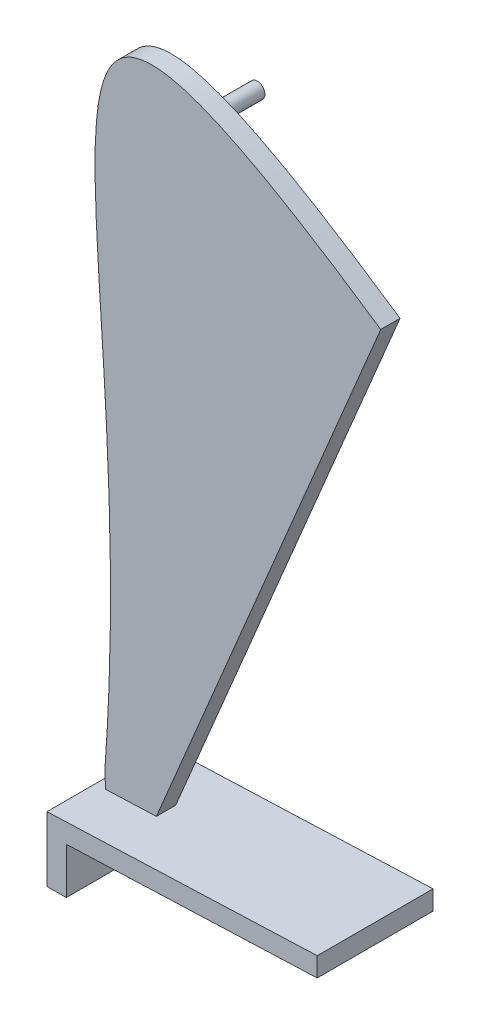
ISO-10303-21;
HEADER;
FILE_DESCRIPTION(('STEP AP214'),'2;1');
FILE_NAME('part.step','',(''),(''),'','','');
FILE_SCHEMA(('AUTOMOTIVE_DESIGN { 1 0 10303 214 1 1 1 1 }'));
ENDSEC;
DATA;
#1=APPLICATION_CONTEXT('core data for automotive mechanical design processes');
#2=APPLICATION_PROTOCOL_DEFINITION('international standard','automotive_design',2000,#1);
#3=PRODUCT_CONTEXT('',#1,'mechanical');
#4=PRODUCT('Part','Part','',(#3));
#5=PRODUCT_RELATED_PRODUCT_CATEGORY('part','',(#4));
#6=PRODUCT_DEFINITION_FORMATION('','',#4);
#7=PRODUCT_DEFINITION_CONTEXT('part definition',#1,'design');
#8=PRODUCT_DEFINITION('design','',#6,#7);
#9=PRODUCT_DEFINITION_SHAPE('','',#8);
#10=(LENGTH_UNIT() NAMED_UNIT(*) SI_UNIT(.MILLI.,.METRE.));
#11=(NAMED_UNIT(*) PLANE_ANGLE_UNIT() SI_UNIT($,.RADIAN.));
#12=(NAMED_UNIT(*) SI_UNIT($,.STERADIAN.) SOLID_ANGLE_UNIT());
#13=UNCERTAINTY_MEASURE_WITH_UNIT(LENGTH_MEASURE(1.E-05),#10,'distance_accuracy_value','');
#14=(GEOMETRIC_REPRESENTATION_CONTEXT(3) GLOBAL_UNCERTAINTY_ASSIGNED_CONTEXT((#13)) GLOBAL_UNIT_ASSIGNED_CONTEXT((#10,
#11,#12)) REPRESENTATION_CONTEXT('',''));
#15=CARTESIAN_POINT('',(0.,0.,0.));
#16=DIRECTION('',(0.,0.,1.));
#17=DIRECTION('',(1.,0.,0.));
#18=AXIS2_PLACEMENT_3D('',#15,#16,#17);
#19=CARTESIAN_POINT('',(-71.,15.773666999042,15.));
#20=DIRECTION('',(0.0384331221012046,-0.999261174631314,0.));
#21=DIRECTION('',(0.999261174631314,0.0384331221012046,0.));
#22=AXIS2_PLACEMENT_3D('',#19,#20,#21);
#23=PLANE('',#22);
#24=DIRECTION('',(-0.999261174631314,-0.0384331221012046,0.));
#25=VECTOR('',#24,1.);
#26=CARTESIAN_POINT('',(-71.,15.773666999042,-15.));
#27=LINE('',#26,#25);
#28=CARTESIAN_POINT('',(-1.,18.4659746913497,-15.));
#29=VERTEX_POINT('',#28);
#30=CARTESIAN_POINT('',(-71.,15.773666999042,-15.));
#31=VERTEX_POINT('',#30);
#32=EDGE_CURVE('E121',#29,#31,#27,.T.);
#33=ORIENTED_EDGE('',*,*,#32,.T.);
#34=DIRECTION('',(0.,0.,-1.));
#35=VECTOR('',#34,1.);
#36=CARTESIAN_POINT('',(-71.,15.773666999042,15.));
#37=LINE('',#36,#35);
#38=CARTESIAN_POINT('',(-71.,15.773666999042,15.));
#39=VERTEX_POINT('',#38);
#40=EDGE_CURVE('E118',#39,#31,#37,.T.);
#41=ORIENTED_EDGE('',*,*,#40,.F.);
#42=DIRECTION('',(-0.999261174631314,-0.0384331221012046,0.));
#43=VECTOR('',#42,1.);
#44=CARTESIAN_POINT('',(-71.,15.773666999042,15.));
#45=LINE('',#44,#43);
#46=CARTESIAN_POINT('',(-1.,18.4659746913497,15.));
#47=VERTEX_POINT('',#46);
#48=EDGE_CURVE('E105',#47,#39,#45,.T.);
#49=ORIENTED_EDGE('',*,*,#48,.F.);
#50=DIRECTION('',(0.,0.,-1.));
#51=VECTOR('',#50,1.);
#52=CARTESIAN_POINT('',(-1.,18.4659746913497,15.));
#53=LINE('',#52,#51);
#54=EDGE_CURVE('E124',#47,#29,#53,.T.);
#55=ORIENTED_EDGE('',*,*,#54,.T.);
#56=EDGE_LOOP('',(#33,#41,#49,#55));
#57=FACE_BOUND('',#56,.T.);
#58=DIRECTION('',(0.999261174631314,0.0384331221012045,0.));
#59=VECTOR('',#58,1.);
#60=CARTESIAN_POINT('',(-55.1599194874851,16.382900864908,2.5));
#61=LINE('',#60,#59);
#62=CARTESIAN_POINT('',(-68.3293207474462,15.8763854318325,2.5));
#63=VERTEX_POINT('',#62);
#64=CARTESIAN_POINT('',(-55.1599194874851,16.382900864908,2.5));
#65=VERTEX_POINT('',#64);
#66=EDGE_CURVE('E175',#63,#65,#61,.T.);
#67=ORIENTED_EDGE('',*,*,#66,.F.);
#68=DIRECTION('',(0.,0.,-1.));
#69=VECTOR('',#68,1.);
#70=CARTESIAN_POINT('',(-68.3293207474462,15.8763854318325,2.5));
#71=LINE('',#70,#69);
#72=CARTESIAN_POINT('',(-68.3293207474462,15.8763854318325,-2.5));
#73=VERTEX_POINT('',#72);
#74=EDGE_CURVE('E168',#63,#73,#71,.T.);
#75=ORIENTED_EDGE('',*,*,#74,.T.);
#76=DIRECTION('',(0.999261174631314,0.0384331221012045,0.));
#77=VECTOR('',#76,1.);
#78=CARTESIAN_POINT('',(-55.1599194874851,16.382900864908,-2.5));
#79=LINE('',#78,#77);
#80=CARTESIAN_POINT('',(-55.1599194874851,16.382900864908,-2.5));
#81=VERTEX_POINT('',#80);
#82=EDGE_CURVE('E186',#73,#81,#79,.T.);
#83=ORIENTED_EDGE('',*,*,#82,.T.);
#84=DIRECTION('',(0.,0.,-1.));
#85=VECTOR('',#84,1.);
#86=CARTESIAN_POINT('',(-55.1599194874851,16.382900864908,2.5));
#87=LINE('',#86,#85);
#88=EDGE_CURVE('E51',#65,#81,#87,.T.);
#89=ORIENTED_EDGE('',*,*,#88,.F.);
#90=EDGE_LOOP('',(#67,#75,#83,#89));
#91=FACE_BOUND('',#90,.T.);
#92=ADVANCED_FACE('F36',(#57,#91),#23,.F.);
#93=CARTESIAN_POINT('',(-66.,-1.,15.));
#94=DIRECTION('',(-1.,0.,0.));
#95=DIRECTION('',(0.,0.,1.));
#96=AXIS2_PLACEMENT_3D('',#93,#94,#95);
#97=PLANE('',#96);
#98=DIRECTION('',(0.,1.,0.));
#99=VECTOR('',#98,1.);
#100=CARTESIAN_POINT('',(-66.,-1.,-15.));
#101=LINE('',#100,#99);
#102=CARTESIAN_POINT('',(-66.,-1.,-15.));
#103=VERTEX_POINT('',#102);
#104=CARTESIAN_POINT('',(-66.,10.9622778331737,-15.));
#105=VERTEX_POINT('',#104);
#106=EDGE_CURVE('E133',#103,#105,#101,.T.);
#107=ORIENTED_EDGE('',*,*,#106,.T.);
#108=DIRECTION('',(0.,0.,-1.));
#109=VECTOR('',#108,1.);
#110=CARTESIAN_POINT('',(-66.,10.9622778331737,15.));
#111=LINE('',#110,#109);
#112=CARTESIAN_POINT('',(-66.,10.9622778331737,15.));
#113=VERTEX_POINT('',#112);
#114=EDGE_CURVE('E11',#113,#105,#111,.T.);
#115=ORIENTED_EDGE('',*,*,#114,.F.);
#116=DIRECTION('',(0.,1.,0.));
#117=VECTOR('',#116,1.);
#118=CARTESIAN_POINT('',(-66.,-1.,15.));
#119=LINE('',#118,#117);
#120=CARTESIAN_POINT('',(-66.,-1.,15.));
#121=VERTEX_POINT('',#120);
#122=EDGE_CURVE('E144',#121,#113,#119,.T.);
#123=ORIENTED_EDGE('',*,*,#122,.F.);
#124=DIRECTION('',(0.,0.,-1.));
#125=VECTOR('',#124,1.);
#126=CARTESIAN_POINT('',(-66.,-1.,15.));
#127=LINE('',#126,#125);
#128=EDGE_CURVE('E129',#121,#103,#127,.T.);
#129=ORIENTED_EDGE('',*,*,#128,.T.);
#130=EDGE_LOOP('',(#107,#115,#123,#129));
#131=FACE_BOUND('',#130,.T.);
#132=ADVANCED_FACE('F38',(#131),#97,.F.);
#133=CARTESIAN_POINT('',(-66.,10.9622778331737,15.));
#134=DIRECTION('',(-0.0384331221012046,0.999261174631314,0.));
#135=DIRECTION('',(-0.999261174631314,-0.0384331221012046,0.));
#136=AXIS2_PLACEMENT_3D('',#133,#134,#135);
#137=PLANE('',#136);
#138=DIRECTION('',(0.999261174631314,0.0384331221012046,0.));
#139=VECTOR('',#138,1.);
#140=CARTESIAN_POINT('',(-66.,10.9622778331737,-15.));
#141=LINE('',#140,#139);
#142=CARTESIAN_POINT('',(-1.,13.4622778331737,-15.));
#143=VERTEX_POINT('',#142);
#144=EDGE_CURVE('E136',#105,#143,#141,.T.);
#145=ORIENTED_EDGE('',*,*,#144,.T.);
#146=DIRECTION('',(0.,0.,-1.));
#147=VECTOR('',#146,1.);
#148=CARTESIAN_POINT('',(-1.,13.4622778331737,15.));
#149=LINE('',#148,#147);
#150=CARTESIAN_POINT('',(-1.,13.4622778331737,15.));
#151=VERTEX_POINT('',#150);
#152=EDGE_CURVE('E44',#151,#143,#149,.T.);
#153=ORIENTED_EDGE('',*,*,#152,.F.);
#154=DIRECTION('',(0.999261174631314,0.0384331221012046,0.));
#155=VECTOR('',#154,1.);
#156=CARTESIAN_POINT('',(-66.,10.9622778331737,15.));
#157=LINE('',#156,#155);
#158=EDGE_CURVE('E95',#113,#151,#157,.T.);
#159=ORIENTED_EDGE('',*,*,#158,.F.);
#160=ORIENTED_EDGE('',*,*,#114,.T.);
#161=EDGE_LOOP('',(#145,#153,#159,#160));
#162=FACE_BOUND('',#161,.T.);
#163=ADVANCED_FACE('F225',(#162),#137,.F.);
#164=CARTESIAN_POINT('',(-1.,13.4622778331737,15.));
#165=DIRECTION('',(-1.,0.,0.));
#166=DIRECTION('',(0.,0.,1.));
#167=AXIS2_PLACEMENT_3D('',#164,#165,#166);
#168=PLANE('',#167);
#169=DIRECTION('',(0.,1.,0.));
#170=VECTOR('',#169,1.);
#171=CARTESIAN_POINT('',(-1.,13.4622778331737,-15.));
#172=LINE('',#171,#170);
#173=EDGE_CURVE('E138',#143,#29,#172,.T.);
#174=ORIENTED_EDGE('',*,*,#173,.T.);
#175=ORIENTED_EDGE('',*,*,#54,.F.);
#176=DIRECTION('',(0.,1.,0.));
#177=VECTOR('',#176,1.);
#178=CARTESIAN_POINT('',(-1.,13.4622778331737,15.));
#179=LINE('',#178,#177);
#180=EDGE_CURVE('E112',#151,#47,#179,.T.);
#181=ORIENTED_EDGE('',*,*,#180,.F.);
#182=ORIENTED_EDGE('',*,*,#152,.T.);
#183=EDGE_LOOP('',(#174,#175,#181,#182));
#184=FACE_BOUND('',#183,.T.);
#185=ADVANCED_FACE('F150',(#184),#168,.F.);
#186=CARTESIAN_POINT('',(-71.,-1.,15.));
#187=DIRECTION('',(1.,0.,0.));
#188=DIRECTION('',(0.,0.,-1.));
#189=AXIS2_PLACEMENT_3D('',#186,#187,#188);
#190=PLANE('',#189);
#191=DIRECTION('',(0.,-1.,0.));
#192=VECTOR('',#191,1.);
#193=CARTESIAN_POINT('',(-71.,-1.,-15.));
#194=LINE('',#193,#192);
#195=CARTESIAN_POINT('',(-71.,-1.,-15.));
#196=VERTEX_POINT('',#195);
#197=EDGE_CURVE('E141',#31,#196,#194,.T.);
#198=ORIENTED_EDGE('',*,*,#197,.T.);
#199=DIRECTION('',(0.,0.,-1.));
#200=VECTOR('',#199,1.);
#201=CARTESIAN_POINT('',(-71.,-1.,15.));
#202=LINE('',#201,#200);
#203=CARTESIAN_POINT('',(-71.,-1.,15.));
#204=VERTEX_POINT('',#203);
#205=EDGE_CURVE('E125',#204,#196,#202,.T.);
#206=ORIENTED_EDGE('',*,*,#205,.F.);
#207=DIRECTION('',(0.,-1.,0.));
#208=VECTOR('',#207,1.);
#209=CARTESIAN_POINT('',(-71.,-1.,15.));
#210=LINE('',#209,#208);
#211=EDGE_CURVE('E109',#39,#204,#210,.T.);
#212=ORIENTED_EDGE('',*,*,#211,.F.);
#213=ORIENTED_EDGE('',*,*,#40,.T.);
#214=EDGE_LOOP('',(#198,#206,#212,#213));
#215=FACE_BOUND('',#214,.T.);
#216=ADVANCED_FACE('F127',(#215),#190,.F.);
#217=CARTESIAN_POINT('',(-66.,-1.,15.));
#218=DIRECTION('',(0.,1.,0.));
#219=DIRECTION('',(0.,0.,1.));
#220=AXIS2_PLACEMENT_3D('',#217,#218,#219);
#221=PLANE('',#220);
#222=DIRECTION('',(1.,0.,0.));
#223=VECTOR('',#222,1.);
#224=CARTESIAN_POINT('',(-66.,-1.,-15.));
#225=LINE('',#224,#223);
#226=EDGE_CURVE('E87',#196,#103,#225,.T.);
#227=ORIENTED_EDGE('',*,*,#226,.T.);
#228=ORIENTED_EDGE('',*,*,#128,.F.);
#229=DIRECTION('',(1.,0.,0.));
#230=VECTOR('',#229,1.);
#231=CARTESIAN_POINT('',(-66.,-1.,15.));
#232=LINE('',#231,#230);
#233=EDGE_CURVE('E60',#204,#121,#232,.T.);
#234=ORIENTED_EDGE('',*,*,#233,.F.);
#235=ORIENTED_EDGE('',*,*,#205,.T.);
#236=EDGE_LOOP('',(#227,#228,#234,#235));
#237=FACE_BOUND('',#236,.T.);
#238=ADVANCED_FACE('F154',(#237),#221,.F.);
#239=CARTESIAN_POINT('',(0.,0.,15.));
#240=DIRECTION('',(0.,0.,1.));
#241=DIRECTION('',(1.,0.,0.));
#242=AXIS2_PLACEMENT_3D('',#239,#240,#241);
#243=PLANE('',#242);
#244=ORIENTED_EDGE('',*,*,#122,.T.);
#245=ORIENTED_EDGE('',*,*,#158,.T.);
#246=ORIENTED_EDGE('',*,*,#180,.T.);
#247=ORIENTED_EDGE('',*,*,#48,.T.);
#248=ORIENTED_EDGE('',*,*,#211,.T.);
#249=ORIENTED_EDGE('',*,*,#233,.T.);
#250=EDGE_LOOP('',(#244,#245,#246,#247,#248,#249));
#251=FACE_BOUND('',#250,.T.);
#252=ADVANCED_FACE('F107',(#251),#243,.T.);
#253=CARTESIAN_POINT('',(0.,0.,-15.));
#254=DIRECTION('',(0.,0.,1.));
#255=DIRECTION('',(1.,0.,0.));
#256=AXIS2_PLACEMENT_3D('',#253,#254,#255);
#257=PLANE('',#256);
#258=ORIENTED_EDGE('',*,*,#106,.F.);
#259=ORIENTED_EDGE('',*,*,#226,.F.);
#260=ORIENTED_EDGE('',*,*,#197,.F.);
#261=ORIENTED_EDGE('',*,*,#32,.F.);
#262=ORIENTED_EDGE('',*,*,#173,.F.);
#263=ORIENTED_EDGE('',*,*,#144,.F.);
#264=EDGE_LOOP('',(#258,#259,#260,#261,#262,#263));
#265=FACE_BOUND('',#264,.T.);
#266=ADVANCED_FACE('F153',(#265),#257,.F.);
#267=CARTESIAN_POINT('',(-55.1599194874851,16.382900864908,2.5));
#268=DIRECTION('',(-0.921880723107427,0.387473782807208,0.));
#269=DIRECTION('',(-0.387473782807208,-0.921880723107427,0.));
#270=AXIS2_PLACEMENT_3D('',#267,#268,#269);
#271=PLANE('',#270);
#272=DIRECTION('',(0.387473782807208,0.921880723107427,0.));
#273=VECTOR('',#272,1.);
#274=CARTESIAN_POINT('',(-55.1599194874851,16.382900864908,-2.5));
#275=LINE('',#274,#273);
#276=CARTESIAN_POINT('',(2.9611479335966,154.665009331022,-2.5));
#277=VERTEX_POINT('',#276);
#278=EDGE_CURVE('E181',#81,#277,#275,.T.);
#279=ORIENTED_EDGE('',*,*,#278,.T.);
#280=DIRECTION('',(0.,0.,-1.));
#281=VECTOR('',#280,1.);
#282=CARTESIAN_POINT('',(2.9611479335966,154.665009331022,2.5));
#283=LINE('',#282,#281);
#284=CARTESIAN_POINT('',(2.9611479335966,154.665009331022,2.5));
#285=VERTEX_POINT('',#284);
#286=EDGE_CURVE('E162',#285,#277,#283,.T.);
#287=ORIENTED_EDGE('',*,*,#286,.F.);
#288=DIRECTION('',(0.387473782807208,0.921880723107427,0.));
#289=VECTOR('',#288,1.);
#290=CARTESIAN_POINT('',(-55.1599194874851,16.382900864908,2.5));
#291=LINE('',#290,#289);
#292=EDGE_CURVE('E198',#65,#285,#291,.T.);
#293=ORIENTED_EDGE('',*,*,#292,.F.);
#294=ORIENTED_EDGE('',*,*,#88,.T.);
#295=EDGE_LOOP('',(#279,#287,#293,#294));
#296=FACE_BOUND('',#295,.T.);
#297=ADVANCED_FACE('F209',(#296),#271,.F.);
#298=CARTESIAN_POINT('',(2.9611479335966,154.665009331022,2.5));
#299=CARTESIAN_POINT('',(-107.856515034297,229.820456606752,2.5));
#300=CARTESIAN_POINT('',(-58.4462393668837,154.187541724249,2.5));
#301=CARTESIAN_POINT('',(-68.4960806595502,20.2121431465384,2.5));
#302=B_SPLINE_CURVE_WITH_KNOTS('',3,(#298,#299,#300,#301),.UNSPECIFIED.,.F.,.F.,(4,4),(0.,1.),.UNSPECIFIED.);
#303=DIRECTION('',(0.,0.,-1.));
#304=VECTOR('',#303,1.);
#305=SURFACE_OF_LINEAR_EXTRUSION('',#302,#304);
#306=CARTESIAN_POINT('',(2.9611479335966,154.665009331022,-2.5));
#307=CARTESIAN_POINT('',(-107.856515034297,229.820456606752,-2.5));
#308=CARTESIAN_POINT('',(-58.4462393668837,154.187541724249,-2.5));
#309=CARTESIAN_POINT('',(-68.4960806595502,20.2121431465384,-2.5));
#310=B_SPLINE_CURVE_WITH_KNOTS('',3,(#306,#307,#308,#309),.UNSPECIFIED.,.F.,.F.,(4,4),(0.,1.),.UNSPECIFIED.);
#311=CARTESIAN_POINT('',(-68.4960806595502,20.2121431465384,-2.5));
#312=VERTEX_POINT('',#311);
#313=EDGE_CURVE('E176',#277,#312,#310,.T.);
#314=ORIENTED_EDGE('',*,*,#313,.T.);
#315=DIRECTION('',(0.,0.,-1.));
#316=VECTOR('',#315,1.);
#317=CARTESIAN_POINT('',(-68.4960806595502,20.2121431465384,2.5));
#318=LINE('',#317,#316);
#319=CARTESIAN_POINT('',(-68.4960806595502,20.2121431465384,2.5));
#320=VERTEX_POINT('',#319);
#321=EDGE_CURVE('E165',#320,#312,#318,.T.);
#322=ORIENTED_EDGE('',*,*,#321,.F.);
#323=EDGE_CURVE('E192',#285,#320,#302,.T.);
#324=ORIENTED_EDGE('',*,*,#323,.F.);
#325=ORIENTED_EDGE('',*,*,#286,.T.);
#326=EDGE_LOOP('',(#314,#322,#324,#325));
#327=FACE_BOUND('',#326,.T.);
#328=ADVANCED_FACE('F204',(#327),#305,.F.);
#329=CARTESIAN_POINT('',(-68.3293207474462,15.8763854318325,2.5));
#330=DIRECTION('',(0.999261174631314,0.0384331221012052,0.));
#331=DIRECTION('',(-0.0384331221012052,0.999261174631314,0.));
#332=AXIS2_PLACEMENT_3D('',#329,#330,#331);
#333=PLANE('',#332);
#334=DIRECTION('',(0.0384331221012052,-0.999261174631314,0.));
#335=VECTOR('',#334,1.);
#336=CARTESIAN_POINT('',(-68.3293207474462,15.8763854318325,-2.5));
#337=LINE('',#336,#335);
#338=EDGE_CURVE('E172',#312,#73,#337,.T.);
#339=ORIENTED_EDGE('',*,*,#338,.T.);
#340=ORIENTED_EDGE('',*,*,#74,.F.);
#341=DIRECTION('',(0.0384331221012052,-0.999261174631314,0.));
#342=VECTOR('',#341,1.);
#343=CARTESIAN_POINT('',(-68.3293207474462,15.8763854318325,2.5));
#344=LINE('',#343,#342);
#345=EDGE_CURVE('E171',#320,#63,#344,.T.);
#346=ORIENTED_EDGE('',*,*,#345,.F.);
#347=ORIENTED_EDGE('',*,*,#321,.T.);
#348=EDGE_LOOP('',(#339,#340,#346,#347));
#349=FACE_BOUND('',#348,.T.);
#350=ADVANCED_FACE('F208',(#349),#333,.F.);
#351=CARTESIAN_POINT('',(-70.5553994911869,165.862643433821,2.5));
#352=DIRECTION('',(0.,0.,-1.));
#353=DIRECTION('',(-1.,0.,0.));
#354=AXIS2_PLACEMENT_3D('',#351,#352,#353);
#355=PLANE('',#354);
#356=ORIENTED_EDGE('',*,*,#66,.T.);
#357=ORIENTED_EDGE('',*,*,#292,.T.);
#358=ORIENTED_EDGE('',*,*,#323,.T.);
#359=ORIENTED_EDGE('',*,*,#345,.T.);
#360=EDGE_LOOP('',(#356,#357,#358,#359));
#361=FACE_BOUND('',#360,.T.);
#362=ADVANCED_FACE('F264',(#361),#355,.F.);
#363=CARTESIAN_POINT('',(-70.5553994911869,165.862643433821,-2.5));
#364=DIRECTION('',(0.,0.,-1.));
#365=DIRECTION('',(-1.,0.,0.));
#366=AXIS2_PLACEMENT_3D('',#363,#364,#365);
#367=PLANE('',#366);
#368=CARTESIAN_POINT('',(-49.0388520664034,172.382900864908,-2.5));
#369=DIRECTION('',(0.,0.,-1.));
#370=DIRECTION('',(-1.,0.,0.));
#371=AXIS2_PLACEMENT_3D('',#368,#369,#370);
#372=CIRCLE('',#371,2.);
#373=CARTESIAN_POINT('',(-51.0388520664034,172.382900864908,-2.5));
#374=VERTEX_POINT('',#373);
#375=EDGE_CURVE('E320',#374,#374,#372,.T.);
#376=ORIENTED_EDGE('',*,*,#375,.F.);
#377=EDGE_LOOP('',(#376));
#378=FACE_BOUND('',#377,.T.);
#379=ORIENTED_EDGE('',*,*,#82,.F.);
#380=ORIENTED_EDGE('',*,*,#338,.F.);
#381=ORIENTED_EDGE('',*,*,#313,.F.);
#382=ORIENTED_EDGE('',*,*,#278,.F.);
#383=EDGE_LOOP('',(#379,#380,#381,#382));
#384=FACE_BOUND('',#383,.T.);
#385=ADVANCED_FACE('F274',(#378,#384),#367,.T.);
#386=CARTESIAN_POINT('',(-49.0388520664034,172.382900864908,-17.5));
#387=DIRECTION('',(0.,0.,1.));
#388=DIRECTION('',(1.,0.,0.));
#389=AXIS2_PLACEMENT_3D('',#386,#387,#388);
#390=CYLINDRICAL_SURFACE('',#389,2.);
#391=CARTESIAN_POINT('',(-49.0388520664034,172.382900864908,-17.5));
#392=DIRECTION('',(0.,0.,-1.));
#393=DIRECTION('',(-1.,0.,0.));
#394=AXIS2_PLACEMENT_3D('',#391,#392,#393);
#395=CIRCLE('',#394,2.);
#396=CARTESIAN_POINT('',(-51.0388520664034,172.382900864908,-17.5));
#397=VERTEX_POINT('',#396);
#398=EDGE_CURVE('E189',#397,#397,#395,.T.);
#399=ORIENTED_EDGE('',*,*,#398,.F.);
#400=EDGE_LOOP('',(#399));
#401=FACE_BOUND('',#400,.T.);
#402=ORIENTED_EDGE('',*,*,#375,.T.);
#403=EDGE_LOOP('',(#402));
#404=FACE_BOUND('',#403,.T.);
#405=ADVANCED_FACE('F285',(#401,#404),#390,.T.);
#406=CARTESIAN_POINT('',(-49.0388520664034,172.382900864908,-17.5));
#407=DIRECTION('',(0.,0.,-1.));
#408=DIRECTION('',(-1.,0.,0.));
#409=AXIS2_PLACEMENT_3D('',#406,#407,#408);
#410=PLANE('',#409);
#411=ORIENTED_EDGE('',*,*,#398,.T.);
#412=EDGE_LOOP('',(#411));
#413=FACE_BOUND('',#412,.T.);
#414=ADVANCED_FACE('F295',(#413),#410,.T.);
#415=CLOSED_SHELL('',(#92,#132,#163,#185,#216,#238,#252,#266,#297,#328,#350,#362,#385,#405,#414));
#416=MANIFOLD_SOLID_BREP('B2',#415);
#417=ADVANCED_BREP_SHAPE_REPRESENTATION('',(#18,#416),#14);
#418=SHAPE_DEFINITION_REPRESENTATION(#9,#417);
ENDSEC;
END-ISO-10303-21;
